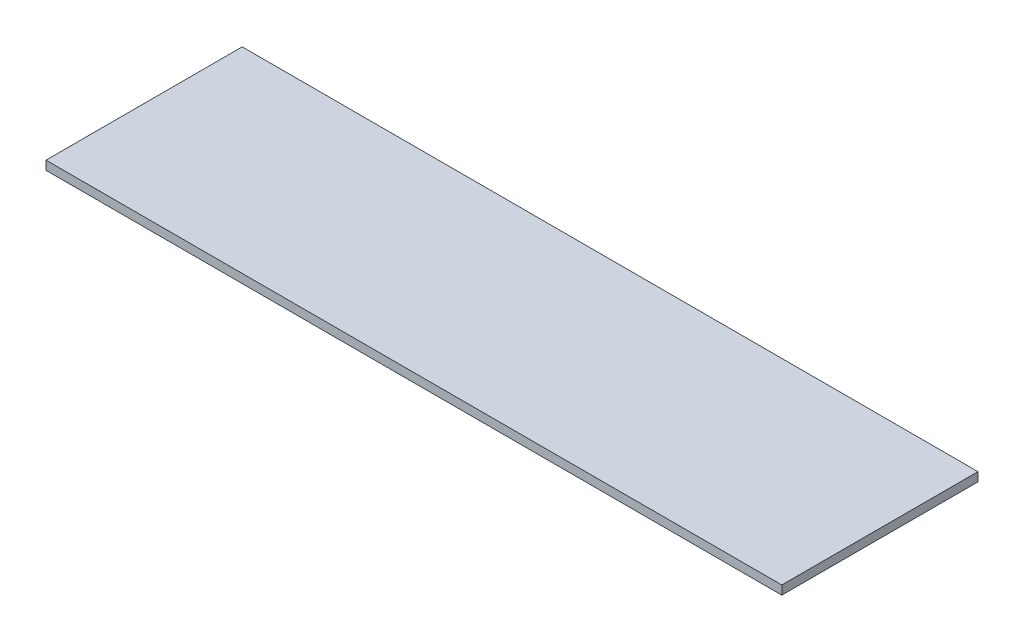
ISO-10303-21;
HEADER;
FILE_DESCRIPTION(('STEP AP214'),'2;1');
FILE_NAME('part.step','',(''),(''),'','','');
FILE_SCHEMA(('AUTOMOTIVE_DESIGN { 1 0 10303 214 1 1 1 1 }'));
ENDSEC;
DATA;
#1=APPLICATION_CONTEXT('core data for automotive mechanical design processes');
#2=APPLICATION_PROTOCOL_DEFINITION('international standard','automotive_design',2000,#1);
#3=PRODUCT_CONTEXT('',#1,'mechanical');
#4=PRODUCT('Part','Part','',(#3));
#5=PRODUCT_RELATED_PRODUCT_CATEGORY('part','',(#4));
#6=PRODUCT_DEFINITION_FORMATION('','',#4);
#7=PRODUCT_DEFINITION_CONTEXT('part definition',#1,'design');
#8=PRODUCT_DEFINITION('design','',#6,#7);
#9=PRODUCT_DEFINITION_SHAPE('','',#8);
#10=(LENGTH_UNIT() NAMED_UNIT(*) SI_UNIT(.MILLI.,.METRE.));
#11=(NAMED_UNIT(*) PLANE_ANGLE_UNIT() SI_UNIT($,.RADIAN.));
#12=(NAMED_UNIT(*) SI_UNIT($,.STERADIAN.) SOLID_ANGLE_UNIT());
#13=UNCERTAINTY_MEASURE_WITH_UNIT(LENGTH_MEASURE(1.E-05),#10,'distance_accuracy_value','');
#14=(GEOMETRIC_REPRESENTATION_CONTEXT(3) GLOBAL_UNCERTAINTY_ASSIGNED_CONTEXT((#13)) GLOBAL_UNIT_ASSIGNED_CONTEXT((#10,
#11,#12)) REPRESENTATION_CONTEXT('',''));
#15=CARTESIAN_POINT('',(0.,0.,0.));
#16=DIRECTION('',(0.,0.,1.));
#17=DIRECTION('',(1.,0.,0.));
#18=AXIS2_PLACEMENT_3D('',#15,#16,#17);
#19=CARTESIAN_POINT('',(750.,18.,-200.));
#20=DIRECTION('',(-1.,0.,0.));
#21=DIRECTION('',(0.,0.,1.));
#22=AXIS2_PLACEMENT_3D('',#19,#20,#21);
#23=PLANE('',#22);
#24=DIRECTION('',(0.,0.,-1.));
#25=VECTOR('',#24,1.);
#26=CARTESIAN_POINT('',(750.,0.,-200.));
#27=LINE('',#26,#25);
#28=CARTESIAN_POINT('',(750.,0.,200.));
#29=VERTEX_POINT('',#28);
#30=CARTESIAN_POINT('',(750.,0.,-200.));
#31=VERTEX_POINT('',#30);
#32=EDGE_CURVE('E96',#29,#31,#27,.T.);
#33=ORIENTED_EDGE('',*,*,#32,.T.);
#34=DIRECTION('',(0.,-1.,0.));
#35=VECTOR('',#34,1.);
#36=CARTESIAN_POINT('',(750.,18.,-200.));
#37=LINE('',#36,#35);
#38=CARTESIAN_POINT('',(750.,18.,-200.));
#39=VERTEX_POINT('',#38);
#40=EDGE_CURVE('E11',#39,#31,#37,.T.);
#41=ORIENTED_EDGE('',*,*,#40,.F.);
#42=DIRECTION('',(0.,0.,-1.));
#43=VECTOR('',#42,1.);
#44=CARTESIAN_POINT('',(750.,18.,-200.));
#45=LINE('',#44,#43);
#46=CARTESIAN_POINT('',(750.,18.,200.));
#47=VERTEX_POINT('',#46);
#48=EDGE_CURVE('E84',#47,#39,#45,.T.);
#49=ORIENTED_EDGE('',*,*,#48,.F.);
#50=DIRECTION('',(0.,-1.,0.));
#51=VECTOR('',#50,1.);
#52=CARTESIAN_POINT('',(750.,18.,200.));
#53=LINE('',#52,#51);
#54=EDGE_CURVE('E92',#47,#29,#53,.T.);
#55=ORIENTED_EDGE('',*,*,#54,.T.);
#56=EDGE_LOOP('',(#33,#41,#49,#55));
#57=FACE_BOUND('',#56,.T.);
#58=ADVANCED_FACE('F33',(#57),#23,.F.);
#59=CARTESIAN_POINT('',(-750.,18.,-200.));
#60=DIRECTION('',(0.,0.,1.));
#61=DIRECTION('',(1.,0.,0.));
#62=AXIS2_PLACEMENT_3D('',#59,#60,#61);
#63=PLANE('',#62);
#64=DIRECTION('',(-1.,0.,0.));
#65=VECTOR('',#64,1.);
#66=CARTESIAN_POINT('',(-750.,0.,-200.));
#67=LINE('',#66,#65);
#68=CARTESIAN_POINT('',(-750.,0.,-200.));
#69=VERTEX_POINT('',#68);
#70=EDGE_CURVE('E88',#31,#69,#67,.T.);
#71=ORIENTED_EDGE('',*,*,#70,.T.);
#72=DIRECTION('',(0.,-1.,0.));
#73=VECTOR('',#72,1.);
#74=CARTESIAN_POINT('',(-750.,18.,-200.));
#75=LINE('',#74,#73);
#76=CARTESIAN_POINT('',(-750.,18.,-200.));
#77=VERTEX_POINT('',#76);
#78=EDGE_CURVE('E41',#77,#69,#75,.T.);
#79=ORIENTED_EDGE('',*,*,#78,.F.);
#80=DIRECTION('',(-1.,0.,0.));
#81=VECTOR('',#80,1.);
#82=CARTESIAN_POINT('',(-750.,18.,-200.));
#83=LINE('',#82,#81);
#84=EDGE_CURVE('E79',#39,#77,#83,.T.);
#85=ORIENTED_EDGE('',*,*,#84,.F.);
#86=ORIENTED_EDGE('',*,*,#40,.T.);
#87=EDGE_LOOP('',(#71,#79,#85,#86));
#88=FACE_BOUND('',#87,.T.);
#89=ADVANCED_FACE('F87',(#88),#63,.F.);
#90=CARTESIAN_POINT('',(-750.,18.,-200.));
#91=DIRECTION('',(1.,0.,0.));
#92=DIRECTION('',(0.,0.,-1.));
#93=AXIS2_PLACEMENT_3D('',#90,#91,#92);
#94=PLANE('',#93);
#95=DIRECTION('',(0.,0.,1.));
#96=VECTOR('',#95,1.);
#97=CARTESIAN_POINT('',(-750.,0.,-200.));
#98=LINE('',#97,#96);
#99=CARTESIAN_POINT('',(-750.,0.,200.));
#100=VERTEX_POINT('',#99);
#101=EDGE_CURVE('E66',#69,#100,#98,.T.);
#102=ORIENTED_EDGE('',*,*,#101,.T.);
#103=DIRECTION('',(0.,-1.,0.));
#104=VECTOR('',#103,1.);
#105=CARTESIAN_POINT('',(-750.,18.,200.));
#106=LINE('',#105,#104);
#107=CARTESIAN_POINT('',(-750.,18.,200.));
#108=VERTEX_POINT('',#107);
#109=EDGE_CURVE('E89',#108,#100,#106,.T.);
#110=ORIENTED_EDGE('',*,*,#109,.F.);
#111=DIRECTION('',(0.,0.,1.));
#112=VECTOR('',#111,1.);
#113=CARTESIAN_POINT('',(-750.,18.,-200.));
#114=LINE('',#113,#112);
#115=EDGE_CURVE('E82',#77,#108,#114,.T.);
#116=ORIENTED_EDGE('',*,*,#115,.F.);
#117=ORIENTED_EDGE('',*,*,#78,.T.);
#118=EDGE_LOOP('',(#102,#110,#116,#117));
#119=FACE_BOUND('',#118,.T.);
#120=ADVANCED_FACE('F90',(#119),#94,.F.);
#121=CARTESIAN_POINT('',(-750.,18.,200.));
#122=DIRECTION('',(0.,0.,-1.));
#123=DIRECTION('',(-1.,0.,0.));
#124=AXIS2_PLACEMENT_3D('',#121,#122,#123);
#125=PLANE('',#124);
#126=DIRECTION('',(1.,0.,0.));
#127=VECTOR('',#126,1.);
#128=CARTESIAN_POINT('',(-750.,0.,200.));
#129=LINE('',#128,#127);
#130=EDGE_CURVE('E72',#100,#29,#129,.T.);
#131=ORIENTED_EDGE('',*,*,#130,.T.);
#132=ORIENTED_EDGE('',*,*,#54,.F.);
#133=DIRECTION('',(1.,0.,0.));
#134=VECTOR('',#133,1.);
#135=CARTESIAN_POINT('',(-750.,18.,200.));
#136=LINE('',#135,#134);
#137=EDGE_CURVE('E49',#108,#47,#136,.T.);
#138=ORIENTED_EDGE('',*,*,#137,.F.);
#139=ORIENTED_EDGE('',*,*,#109,.T.);
#140=EDGE_LOOP('',(#131,#132,#138,#139));
#141=FACE_BOUND('',#140,.T.);
#142=ADVANCED_FACE('F103',(#141),#125,.F.);
#143=CARTESIAN_POINT('',(0.,18.,0.));
#144=DIRECTION('',(0.,1.,0.));
#145=DIRECTION('',(0.,0.,1.));
#146=AXIS2_PLACEMENT_3D('',#143,#144,#145);
#147=PLANE('',#146);
#148=ORIENTED_EDGE('',*,*,#48,.T.);
#149=ORIENTED_EDGE('',*,*,#84,.T.);
#150=ORIENTED_EDGE('',*,*,#115,.T.);
#151=ORIENTED_EDGE('',*,*,#137,.T.);
#152=EDGE_LOOP('',(#148,#149,#150,#151));
#153=FACE_BOUND('',#152,.T.);
#154=ADVANCED_FACE('F80',(#153),#147,.T.);
#155=CARTESIAN_POINT('',(0.,0.,0.));
#156=DIRECTION('',(0.,1.,0.));
#157=DIRECTION('',(0.,0.,1.));
#158=AXIS2_PLACEMENT_3D('',#155,#156,#157);
#159=PLANE('',#158);
#160=ORIENTED_EDGE('',*,*,#32,.F.);
#161=ORIENTED_EDGE('',*,*,#130,.F.);
#162=ORIENTED_EDGE('',*,*,#101,.F.);
#163=ORIENTED_EDGE('',*,*,#70,.F.);
#164=EDGE_LOOP('',(#160,#161,#162,#163));
#165=FACE_BOUND('',#164,.T.);
#166=ADVANCED_FACE('F106',(#165),#159,.F.);
#167=CLOSED_SHELL('',(#58,#89,#120,#142,#154,#166));
#168=MANIFOLD_SOLID_BREP('B2',#167);
#169=ADVANCED_BREP_SHAPE_REPRESENTATION('',(#18,#168),#14);
#170=SHAPE_DEFINITION_REPRESENTATION(#9,#169);
ENDSEC;
END-ISO-10303-21;
